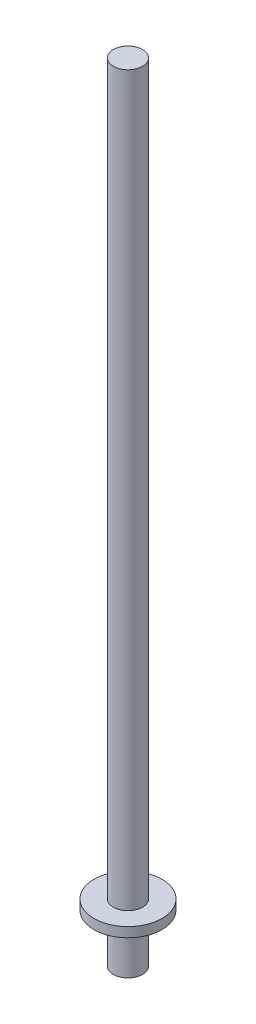
ISO-10303-21;
HEADER;
FILE_DESCRIPTION(('STEP AP214'),'2;1');
FILE_NAME('part.step','',(''),(''),'','','');
FILE_SCHEMA(('AUTOMOTIVE_DESIGN { 1 0 10303 214 1 1 1 1 }'));
ENDSEC;
DATA;
#1=APPLICATION_CONTEXT('core data for automotive mechanical design processes');
#2=APPLICATION_PROTOCOL_DEFINITION('international standard','automotive_design',2000,#1);
#3=PRODUCT_CONTEXT('',#1,'mechanical');
#4=PRODUCT('Part','Part','',(#3));
#5=PRODUCT_RELATED_PRODUCT_CATEGORY('part','',(#4));
#6=PRODUCT_DEFINITION_FORMATION('','',#4);
#7=PRODUCT_DEFINITION_CONTEXT('part definition',#1,'design');
#8=PRODUCT_DEFINITION('design','',#6,#7);
#9=PRODUCT_DEFINITION_SHAPE('','',#8);
#10=(LENGTH_UNIT() NAMED_UNIT(*) SI_UNIT(.MILLI.,.METRE.));
#11=(NAMED_UNIT(*) PLANE_ANGLE_UNIT() SI_UNIT($,.RADIAN.));
#12=(NAMED_UNIT(*) SI_UNIT($,.STERADIAN.) SOLID_ANGLE_UNIT());
#13=UNCERTAINTY_MEASURE_WITH_UNIT(LENGTH_MEASURE(1.E-05),#10,'distance_accuracy_value','');
#14=(GEOMETRIC_REPRESENTATION_CONTEXT(3) GLOBAL_UNCERTAINTY_ASSIGNED_CONTEXT((#13)) GLOBAL_UNIT_ASSIGNED_CONTEXT((#10,
#11,#12)) REPRESENTATION_CONTEXT('',''));
#15=CARTESIAN_POINT('',(0.,0.,0.));
#16=DIRECTION('',(0.,0.,1.));
#17=DIRECTION('',(1.,0.,0.));
#18=AXIS2_PLACEMENT_3D('',#15,#16,#17);
#19=CARTESIAN_POINT('',(0.,0.,0.));
#20=DIRECTION('',(0.,-1.,0.));
#21=DIRECTION('',(0.,0.,-1.));
#22=AXIS2_PLACEMENT_3D('',#19,#20,#21);
#23=PLANE('',#22);
#24=CARTESIAN_POINT('',(0.,0.,0.));
#25=DIRECTION('',(0.,1.,0.));
#26=DIRECTION('',(0.,0.,1.));
#27=AXIS2_PLACEMENT_3D('',#24,#25,#26);
#28=CIRCLE('',#27,3.);
#29=CARTESIAN_POINT('',(0.,0.,3.));
#30=VERTEX_POINT('',#29);
#31=EDGE_CURVE('E10',#30,#30,#28,.T.);
#32=ORIENTED_EDGE('',*,*,#31,.T.);
#33=EDGE_LOOP('',(#32));
#34=FACE_BOUND('',#33,.T.);
#35=ADVANCED_FACE('F31',(#34),#23,.F.);
#36=CARTESIAN_POINT('',(0.,11.6743880231193,0.));
#37=DIRECTION('',(0.,1.,0.));
#38=DIRECTION('',(0.,0.,1.));
#39=AXIS2_PLACEMENT_3D('',#36,#37,#38);
#40=CYLINDRICAL_SURFACE('',#39,3.00000000000001);
#41=ORIENTED_EDGE('',*,*,#31,.F.);
#42=EDGE_LOOP('',(#41));
#43=FACE_BOUND('',#42,.T.);
#44=CARTESIAN_POINT('',(0.,-150.,0.));
#45=DIRECTION('',(0.,1.,0.));
#46=DIRECTION('',(0.,0.,1.));
#47=AXIS2_PLACEMENT_3D('',#44,#45,#46);
#48=CIRCLE('',#47,3.00000000000002);
#49=CARTESIAN_POINT('',(0.,-150.,3.00000000000002));
#50=VERTEX_POINT('',#49);
#51=EDGE_CURVE('E37',#50,#50,#48,.T.);
#52=ORIENTED_EDGE('',*,*,#51,.T.);
#53=EDGE_LOOP('',(#52));
#54=FACE_BOUND('',#53,.T.);
#55=ADVANCED_FACE('F69',(#43,#54),#40,.T.);
#56=CARTESIAN_POINT('',(3.00000000000002,-150.,0.));
#57=DIRECTION('',(0.,-1.,0.));
#58=DIRECTION('',(0.,0.,-1.));
#59=AXIS2_PLACEMENT_3D('',#56,#57,#58);
#60=PLANE('',#59);
#61=ORIENTED_EDGE('',*,*,#51,.F.);
#62=EDGE_LOOP('',(#61));
#63=FACE_BOUND('',#62,.T.);
#64=CARTESIAN_POINT('',(0.,-150.,0.));
#65=DIRECTION('',(0.,1.,0.));
#66=DIRECTION('',(0.,0.,1.));
#67=AXIS2_PLACEMENT_3D('',#64,#65,#66);
#68=CIRCLE('',#67,7.);
#69=CARTESIAN_POINT('',(0.,-150.,7.));
#70=VERTEX_POINT('',#69);
#71=EDGE_CURVE('E41',#70,#70,#68,.T.);
#72=ORIENTED_EDGE('',*,*,#71,.T.);
#73=EDGE_LOOP('',(#72));
#74=FACE_BOUND('',#73,.T.);
#75=ADVANCED_FACE('F73',(#63,#74),#60,.F.);
#76=CARTESIAN_POINT('',(0.,11.6743880231193,0.));
#77=DIRECTION('',(0.,1.,0.));
#78=DIRECTION('',(0.,0.,1.));
#79=AXIS2_PLACEMENT_3D('',#76,#77,#78);
#80=CYLINDRICAL_SURFACE('',#79,7.);
#81=ORIENTED_EDGE('',*,*,#71,.F.);
#82=EDGE_LOOP('',(#81));
#83=FACE_BOUND('',#82,.T.);
#84=CARTESIAN_POINT('',(0.,-152.,0.));
#85=DIRECTION('',(0.,1.,0.));
#86=DIRECTION('',(0.,0.,1.));
#87=AXIS2_PLACEMENT_3D('',#84,#85,#86);
#88=CIRCLE('',#87,7.);
#89=CARTESIAN_POINT('',(0.,-152.,7.));
#90=VERTEX_POINT('',#89);
#91=EDGE_CURVE('E45',#90,#90,#88,.T.);
#92=ORIENTED_EDGE('',*,*,#91,.T.);
#93=EDGE_LOOP('',(#92));
#94=FACE_BOUND('',#93,.T.);
#95=ADVANCED_FACE('F78',(#83,#94),#80,.T.);
#96=CARTESIAN_POINT('',(7.,-152.,0.));
#97=DIRECTION('',(0.,1.,0.));
#98=DIRECTION('',(0.,0.,1.));
#99=AXIS2_PLACEMENT_3D('',#96,#97,#98);
#100=PLANE('',#99);
#101=ORIENTED_EDGE('',*,*,#91,.F.);
#102=EDGE_LOOP('',(#101));
#103=FACE_BOUND('',#102,.T.);
#104=CARTESIAN_POINT('',(0.,-152.,0.));
#105=DIRECTION('',(0.,1.,0.));
#106=DIRECTION('',(0.,0.,1.));
#107=AXIS2_PLACEMENT_3D('',#104,#105,#106);
#108=CIRCLE('',#107,3.);
#109=CARTESIAN_POINT('',(0.,-152.,3.));
#110=VERTEX_POINT('',#109);
#111=EDGE_CURVE('E50',#110,#110,#108,.T.);
#112=ORIENTED_EDGE('',*,*,#111,.T.);
#113=EDGE_LOOP('',(#112));
#114=FACE_BOUND('',#113,.T.);
#115=ADVANCED_FACE('F65',(#103,#114),#100,.F.);
#116=CARTESIAN_POINT('',(0.,11.6743880231193,0.));
#117=DIRECTION('',(0.,1.,0.));
#118=DIRECTION('',(0.,0.,1.));
#119=AXIS2_PLACEMENT_3D('',#116,#117,#118);
#120=CYLINDRICAL_SURFACE('',#119,3.);
#121=ORIENTED_EDGE('',*,*,#111,.F.);
#122=EDGE_LOOP('',(#121));
#123=FACE_BOUND('',#122,.T.);
#124=CARTESIAN_POINT('',(0.,-162.,0.));
#125=DIRECTION('',(0.,1.,0.));
#126=DIRECTION('',(0.,0.,1.));
#127=AXIS2_PLACEMENT_3D('',#124,#125,#126);
#128=CIRCLE('',#127,3.);
#129=CARTESIAN_POINT('',(0.,-162.,3.));
#130=VERTEX_POINT('',#129);
#131=EDGE_CURVE('E53',#130,#130,#128,.T.);
#132=ORIENTED_EDGE('',*,*,#131,.T.);
#133=EDGE_LOOP('',(#132));
#134=FACE_BOUND('',#133,.T.);
#135=ADVANCED_FACE('F57',(#123,#134),#120,.T.);
#136=CARTESIAN_POINT('',(3.,-162.,0.));
#137=DIRECTION('',(0.,1.,0.));
#138=DIRECTION('',(0.,0.,1.));
#139=AXIS2_PLACEMENT_3D('',#136,#137,#138);
#140=PLANE('',#139);
#141=ORIENTED_EDGE('',*,*,#131,.F.);
#142=EDGE_LOOP('',(#141));
#143=FACE_BOUND('',#142,.T.);
#144=ADVANCED_FACE('F59',(#143),#140,.F.);
#145=CLOSED_SHELL('',(#35,#55,#75,#95,#115,#135,#144));
#146=MANIFOLD_SOLID_BREP('B2',#145);
#147=ADVANCED_BREP_SHAPE_REPRESENTATION('',(#18,#146),#14);
#148=SHAPE_DEFINITION_REPRESENTATION(#9,#147);
ENDSEC;
END-ISO-10303-21;
